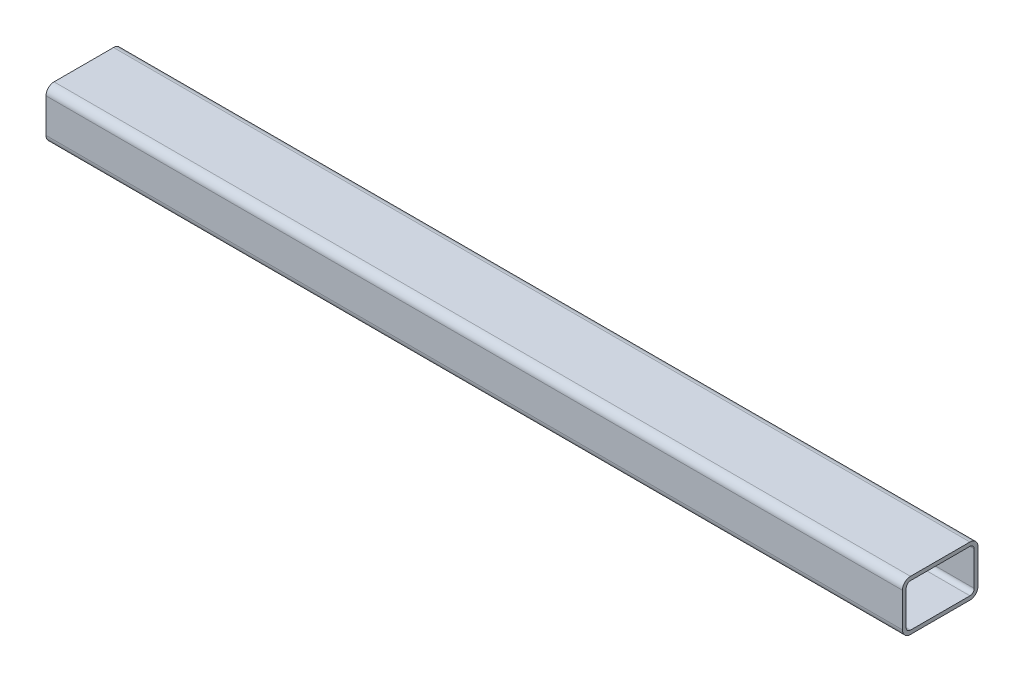
ISO-10303-21;
HEADER;
FILE_DESCRIPTION(('STEP AP214'),'2;1');
FILE_NAME('part.step','',(''),(''),'','','');
FILE_SCHEMA(('AUTOMOTIVE_DESIGN { 1 0 10303 214 1 1 1 1 }'));
ENDSEC;
DATA;
#1=APPLICATION_CONTEXT('core data for automotive mechanical design processes');
#2=APPLICATION_PROTOCOL_DEFINITION('international standard','automotive_design',2000,#1);
#3=PRODUCT_CONTEXT('',#1,'mechanical');
#4=PRODUCT('Part','Part','',(#3));
#5=PRODUCT_RELATED_PRODUCT_CATEGORY('part','',(#4));
#6=PRODUCT_DEFINITION_FORMATION('','',#4);
#7=PRODUCT_DEFINITION_CONTEXT('part definition',#1,'design');
#8=PRODUCT_DEFINITION('design','',#6,#7);
#9=PRODUCT_DEFINITION_SHAPE('','',#8);
#10=(LENGTH_UNIT() NAMED_UNIT(*) SI_UNIT(.MILLI.,.METRE.));
#11=(NAMED_UNIT(*) PLANE_ANGLE_UNIT() SI_UNIT($,.RADIAN.));
#12=(NAMED_UNIT(*) SI_UNIT($,.STERADIAN.) SOLID_ANGLE_UNIT());
#13=UNCERTAINTY_MEASURE_WITH_UNIT(LENGTH_MEASURE(1.E-05),#10,'distance_accuracy_value','');
#14=(GEOMETRIC_REPRESENTATION_CONTEXT(3) GLOBAL_UNCERTAINTY_ASSIGNED_CONTEXT((#13)) GLOBAL_UNIT_ASSIGNED_CONTEXT((#10,
#11,#12)) REPRESENTATION_CONTEXT('',''));
#15=CARTESIAN_POINT('',(0.,0.,0.));
#16=DIRECTION('',(0.,0.,1.));
#17=DIRECTION('',(1.,0.,0.));
#18=AXIS2_PLACEMENT_3D('',#15,#16,#17);
#19=CARTESIAN_POINT('',(340.,13.6,23.6));
#20=DIRECTION('',(-1.,0.,0.));
#21=DIRECTION('',(0.,0.,1.));
#22=AXIS2_PLACEMENT_3D('',#19,#20,#21);
#23=CYLINDRICAL_SURFACE('',#22,6.4);
#24=CARTESIAN_POINT('',(-340.,13.6,23.6));
#25=DIRECTION('',(1.,0.,0.));
#26=DIRECTION('',(0.,0.,-1.));
#27=AXIS2_PLACEMENT_3D('',#24,#25,#26);
#28=CIRCLE('',#27,6.4);
#29=CARTESIAN_POINT('',(-340.,20.,23.6));
#30=VERTEX_POINT('',#29);
#31=CARTESIAN_POINT('',(-340.,13.6,30.));
#32=VERTEX_POINT('',#31);
#33=EDGE_CURVE('E210',#30,#32,#28,.T.);
#34=ORIENTED_EDGE('',*,*,#33,.T.);
#35=DIRECTION('',(-1.,0.,0.));
#36=VECTOR('',#35,1.);
#37=CARTESIAN_POINT('',(340.,13.6,30.));
#38=LINE('',#37,#36);
#39=CARTESIAN_POINT('',(340.,13.6,30.));
#40=VERTEX_POINT('',#39);
#41=EDGE_CURVE('E11',#40,#32,#38,.T.);
#42=ORIENTED_EDGE('',*,*,#41,.F.);
#43=CARTESIAN_POINT('',(340.,13.6,23.6));
#44=DIRECTION('',(1.,0.,0.));
#45=DIRECTION('',(0.,0.,-1.));
#46=AXIS2_PLACEMENT_3D('',#43,#44,#45);
#47=CIRCLE('',#46,6.4);
#48=CARTESIAN_POINT('',(340.,20.,23.6));
#49=VERTEX_POINT('',#48);
#50=EDGE_CURVE('E288',#49,#40,#47,.T.);
#51=ORIENTED_EDGE('',*,*,#50,.F.);
#52=DIRECTION('',(-1.,0.,0.));
#53=VECTOR('',#52,1.);
#54=CARTESIAN_POINT('',(340.,20.,23.6));
#55=LINE('',#54,#53);
#56=EDGE_CURVE('E225',#49,#30,#55,.T.);
#57=ORIENTED_EDGE('',*,*,#56,.T.);
#58=EDGE_LOOP('',(#34,#42,#51,#57));
#59=FACE_BOUND('',#58,.T.);
#60=ADVANCED_FACE('F38',(#59),#23,.T.);
#61=CARTESIAN_POINT('',(340.,13.6,30.));
#62=DIRECTION('',(0.,0.,-1.));
#63=DIRECTION('',(-1.,0.,0.));
#64=AXIS2_PLACEMENT_3D('',#61,#62,#63);
#65=PLANE('',#64);
#66=DIRECTION('',(0.,-1.,0.));
#67=VECTOR('',#66,1.);
#68=CARTESIAN_POINT('',(-340.,13.6,30.));
#69=LINE('',#68,#67);
#70=CARTESIAN_POINT('',(-340.,-13.6,30.));
#71=VERTEX_POINT('',#70);
#72=EDGE_CURVE('E213',#32,#71,#69,.T.);
#73=ORIENTED_EDGE('',*,*,#72,.T.);
#74=DIRECTION('',(-1.,0.,0.));
#75=VECTOR('',#74,1.);
#76=CARTESIAN_POINT('',(340.,-13.6,30.));
#77=LINE('',#76,#75);
#78=CARTESIAN_POINT('',(340.,-13.6,30.));
#79=VERTEX_POINT('',#78);
#80=EDGE_CURVE('E48',#79,#71,#77,.T.);
#81=ORIENTED_EDGE('',*,*,#80,.F.);
#82=DIRECTION('',(0.,-1.,0.));
#83=VECTOR('',#82,1.);
#84=CARTESIAN_POINT('',(340.,13.6,30.));
#85=LINE('',#84,#83);
#86=EDGE_CURVE('E290',#40,#79,#85,.T.);
#87=ORIENTED_EDGE('',*,*,#86,.F.);
#88=ORIENTED_EDGE('',*,*,#41,.T.);
#89=EDGE_LOOP('',(#73,#81,#87,#88));
#90=FACE_BOUND('',#89,.T.);
#91=ADVANCED_FACE('F326',(#90),#65,.F.);
#92=CARTESIAN_POINT('',(340.,-13.6,23.6));
#93=DIRECTION('',(-1.,0.,0.));
#94=DIRECTION('',(0.,0.,1.));
#95=AXIS2_PLACEMENT_3D('',#92,#93,#94);
#96=CYLINDRICAL_SURFACE('',#95,6.4);
#97=CARTESIAN_POINT('',(-340.,-13.6,23.6));
#98=DIRECTION('',(1.,0.,0.));
#99=DIRECTION('',(0.,0.,-1.));
#100=AXIS2_PLACEMENT_3D('',#97,#98,#99);
#101=CIRCLE('',#100,6.4);
#102=CARTESIAN_POINT('',(-340.,-20.,23.6));
#103=VERTEX_POINT('',#102);
#104=EDGE_CURVE('E215',#71,#103,#101,.T.);
#105=ORIENTED_EDGE('',*,*,#104,.T.);
#106=DIRECTION('',(-1.,0.,0.));
#107=VECTOR('',#106,1.);
#108=CARTESIAN_POINT('',(340.,-20.,23.6));
#109=LINE('',#108,#107);
#110=CARTESIAN_POINT('',(340.,-20.,23.6));
#111=VERTEX_POINT('',#110);
#112=EDGE_CURVE('E232',#111,#103,#109,.T.);
#113=ORIENTED_EDGE('',*,*,#112,.F.);
#114=CARTESIAN_POINT('',(340.,-13.6,23.6));
#115=DIRECTION('',(1.,0.,0.));
#116=DIRECTION('',(0.,0.,-1.));
#117=AXIS2_PLACEMENT_3D('',#114,#115,#116);
#118=CIRCLE('',#117,6.4);
#119=EDGE_CURVE('E292',#79,#111,#118,.T.);
#120=ORIENTED_EDGE('',*,*,#119,.F.);
#121=ORIENTED_EDGE('',*,*,#80,.T.);
#122=EDGE_LOOP('',(#105,#113,#120,#121));
#123=FACE_BOUND('',#122,.T.);
#124=ADVANCED_FACE('F332',(#123),#96,.T.);
#125=CARTESIAN_POINT('',(340.,-20.,-23.6));
#126=DIRECTION('',(0.,1.,0.));
#127=DIRECTION('',(0.,0.,1.));
#128=AXIS2_PLACEMENT_3D('',#125,#126,#127);
#129=PLANE('',#128);
#130=DIRECTION('',(0.,0.,-1.));
#131=VECTOR('',#130,1.);
#132=CARTESIAN_POINT('',(-340.,-20.,-23.6));
#133=LINE('',#132,#131);
#134=CARTESIAN_POINT('',(-340.,-20.,-23.6));
#135=VERTEX_POINT('',#134);
#136=EDGE_CURVE('E217',#103,#135,#133,.T.);
#137=ORIENTED_EDGE('',*,*,#136,.T.);
#138=DIRECTION('',(-1.,0.,0.));
#139=VECTOR('',#138,1.);
#140=CARTESIAN_POINT('',(340.,-20.,-23.6));
#141=LINE('',#140,#139);
#142=CARTESIAN_POINT('',(340.,-20.,-23.6));
#143=VERTEX_POINT('',#142);
#144=EDGE_CURVE('E229',#143,#135,#141,.T.);
#145=ORIENTED_EDGE('',*,*,#144,.F.);
#146=DIRECTION('',(0.,0.,-1.));
#147=VECTOR('',#146,1.);
#148=CARTESIAN_POINT('',(340.,-20.,-23.6));
#149=LINE('',#148,#147);
#150=EDGE_CURVE('E294',#111,#143,#149,.T.);
#151=ORIENTED_EDGE('',*,*,#150,.F.);
#152=ORIENTED_EDGE('',*,*,#112,.T.);
#153=EDGE_LOOP('',(#137,#145,#151,#152));
#154=FACE_BOUND('',#153,.T.);
#155=ADVANCED_FACE('F300',(#154),#129,.F.);
#156=CARTESIAN_POINT('',(340.,-13.6,-23.6));
#157=DIRECTION('',(-1.,0.,0.));
#158=DIRECTION('',(0.,0.,1.));
#159=AXIS2_PLACEMENT_3D('',#156,#157,#158);
#160=CYLINDRICAL_SURFACE('',#159,6.4);
#161=CARTESIAN_POINT('',(-340.,-13.6,-23.6));
#162=DIRECTION('',(1.,0.,0.));
#163=DIRECTION('',(0.,0.,-1.));
#164=AXIS2_PLACEMENT_3D('',#161,#162,#163);
#165=CIRCLE('',#164,6.4);
#166=CARTESIAN_POINT('',(-340.,-13.6,-30.));
#167=VERTEX_POINT('',#166);
#168=EDGE_CURVE('E219',#135,#167,#165,.T.);
#169=ORIENTED_EDGE('',*,*,#168,.T.);
#170=DIRECTION('',(-1.,0.,0.));
#171=VECTOR('',#170,1.);
#172=CARTESIAN_POINT('',(340.,-13.6,-30.));
#173=LINE('',#172,#171);
#174=CARTESIAN_POINT('',(340.,-13.6,-30.));
#175=VERTEX_POINT('',#174);
#176=EDGE_CURVE('E177',#175,#167,#173,.T.);
#177=ORIENTED_EDGE('',*,*,#176,.F.);
#178=CARTESIAN_POINT('',(340.,-13.6,-23.6));
#179=DIRECTION('',(1.,0.,0.));
#180=DIRECTION('',(0.,0.,-1.));
#181=AXIS2_PLACEMENT_3D('',#178,#179,#180);
#182=CIRCLE('',#181,6.4);
#183=EDGE_CURVE('E168',#143,#175,#182,.T.);
#184=ORIENTED_EDGE('',*,*,#183,.F.);
#185=ORIENTED_EDGE('',*,*,#144,.T.);
#186=EDGE_LOOP('',(#169,#177,#184,#185));
#187=FACE_BOUND('',#186,.T.);
#188=ADVANCED_FACE('F304',(#187),#160,.T.);
#189=CARTESIAN_POINT('',(340.,-13.6,-30.));
#190=DIRECTION('',(0.,0.,1.));
#191=DIRECTION('',(1.,0.,0.));
#192=AXIS2_PLACEMENT_3D('',#189,#190,#191);
#193=PLANE('',#192);
#194=DIRECTION('',(0.,1.,0.));
#195=VECTOR('',#194,1.);
#196=CARTESIAN_POINT('',(-340.,-13.6,-30.));
#197=LINE('',#196,#195);
#198=CARTESIAN_POINT('',(-340.,13.6,-30.));
#199=VERTEX_POINT('',#198);
#200=EDGE_CURVE('E176',#167,#199,#197,.T.);
#201=ORIENTED_EDGE('',*,*,#200,.T.);
#202=DIRECTION('',(-1.,0.,0.));
#203=VECTOR('',#202,1.);
#204=CARTESIAN_POINT('',(340.,13.6,-30.));
#205=LINE('',#204,#203);
#206=CARTESIAN_POINT('',(340.,13.6,-30.));
#207=VERTEX_POINT('',#206);
#208=EDGE_CURVE('E173',#207,#199,#205,.T.);
#209=ORIENTED_EDGE('',*,*,#208,.F.);
#210=DIRECTION('',(0.,1.,0.));
#211=VECTOR('',#210,1.);
#212=CARTESIAN_POINT('',(340.,-13.6,-30.));
#213=LINE('',#212,#211);
#214=EDGE_CURVE('E162',#175,#207,#213,.T.);
#215=ORIENTED_EDGE('',*,*,#214,.F.);
#216=ORIENTED_EDGE('',*,*,#176,.T.);
#217=EDGE_LOOP('',(#201,#209,#215,#216));
#218=FACE_BOUND('',#217,.T.);
#219=ADVANCED_FACE('F174',(#218),#193,.F.);
#220=CARTESIAN_POINT('',(340.,13.6,-23.6));
#221=DIRECTION('',(-1.,0.,0.));
#222=DIRECTION('',(0.,0.,1.));
#223=AXIS2_PLACEMENT_3D('',#220,#221,#222);
#224=CYLINDRICAL_SURFACE('',#223,6.4);
#225=CARTESIAN_POINT('',(-340.,13.6,-23.6));
#226=DIRECTION('',(1.,0.,0.));
#227=DIRECTION('',(0.,0.,-1.));
#228=AXIS2_PLACEMENT_3D('',#225,#226,#227);
#229=CIRCLE('',#228,6.4);
#230=CARTESIAN_POINT('',(-340.,20.,-23.6));
#231=VERTEX_POINT('',#230);
#232=EDGE_CURVE('E110',#199,#231,#229,.T.);
#233=ORIENTED_EDGE('',*,*,#232,.T.);
#234=DIRECTION('',(-1.,0.,0.));
#235=VECTOR('',#234,1.);
#236=CARTESIAN_POINT('',(340.,20.,-23.6));
#237=LINE('',#236,#235);
#238=CARTESIAN_POINT('',(340.,20.,-23.6));
#239=VERTEX_POINT('',#238);
#240=EDGE_CURVE('E178',#239,#231,#237,.T.);
#241=ORIENTED_EDGE('',*,*,#240,.F.);
#242=CARTESIAN_POINT('',(340.,13.6,-23.6));
#243=DIRECTION('',(1.,0.,0.));
#244=DIRECTION('',(0.,0.,-1.));
#245=AXIS2_PLACEMENT_3D('',#242,#243,#244);
#246=CIRCLE('',#245,6.4);
#247=EDGE_CURVE('E166',#207,#239,#246,.T.);
#248=ORIENTED_EDGE('',*,*,#247,.F.);
#249=ORIENTED_EDGE('',*,*,#208,.T.);
#250=EDGE_LOOP('',(#233,#241,#248,#249));
#251=FACE_BOUND('',#250,.T.);
#252=ADVANCED_FACE('F180',(#251),#224,.T.);
#253=CARTESIAN_POINT('',(340.,-13.6,23.6));
#254=DIRECTION('',(-1.,0.,0.));
#255=DIRECTION('',(0.,0.,1.));
#256=AXIS2_PLACEMENT_3D('',#253,#254,#255);
#257=CYLINDRICAL_SURFACE('',#256,3.4);
#258=CARTESIAN_POINT('',(-340.,-13.6,23.6));
#259=DIRECTION('',(1.,0.,0.));
#260=DIRECTION('',(0.,0.,-1.));
#261=AXIS2_PLACEMENT_3D('',#258,#259,#260);
#262=CIRCLE('',#261,3.4);
#263=CARTESIAN_POINT('',(-340.,-13.6,27.));
#264=VERTEX_POINT('',#263);
#265=CARTESIAN_POINT('',(-340.,-17.,23.6));
#266=VERTEX_POINT('',#265);
#267=EDGE_CURVE('E186',#264,#266,#262,.T.);
#268=ORIENTED_EDGE('',*,*,#267,.F.);
#269=DIRECTION('',(-1.,0.,0.));
#270=VECTOR('',#269,1.);
#271=CARTESIAN_POINT('',(340.,-13.6,27.));
#272=LINE('',#271,#270);
#273=CARTESIAN_POINT('',(340.,-13.6,27.));
#274=VERTEX_POINT('',#273);
#275=EDGE_CURVE('E42',#274,#264,#272,.T.);
#276=ORIENTED_EDGE('',*,*,#275,.F.);
#277=CARTESIAN_POINT('',(340.,-13.6,23.6));
#278=DIRECTION('',(1.,0.,0.));
#279=DIRECTION('',(0.,0.,-1.));
#280=AXIS2_PLACEMENT_3D('',#277,#278,#279);
#281=CIRCLE('',#280,3.4);
#282=CARTESIAN_POINT('',(340.,-17.,23.6));
#283=VERTEX_POINT('',#282);
#284=EDGE_CURVE('E224',#274,#283,#281,.T.);
#285=ORIENTED_EDGE('',*,*,#284,.T.);
#286=DIRECTION('',(-1.,0.,0.));
#287=VECTOR('',#286,1.);
#288=CARTESIAN_POINT('',(340.,-17.,23.6));
#289=LINE('',#288,#287);
#290=EDGE_CURVE('E182',#283,#266,#289,.T.);
#291=ORIENTED_EDGE('',*,*,#290,.T.);
#292=EDGE_LOOP('',(#268,#276,#285,#291));
#293=FACE_BOUND('',#292,.T.);
#294=ADVANCED_FACE('F40',(#293),#257,.F.);
#295=CARTESIAN_POINT('',(340.,13.6,27.));
#296=DIRECTION('',(0.,0.,-1.));
#297=DIRECTION('',(-1.,0.,0.));
#298=AXIS2_PLACEMENT_3D('',#295,#296,#297);
#299=PLANE('',#298);
#300=DIRECTION('',(0.,-1.,0.));
#301=VECTOR('',#300,1.);
#302=CARTESIAN_POINT('',(-340.,13.6,27.));
#303=LINE('',#302,#301);
#304=CARTESIAN_POINT('',(-340.,13.6,27.));
#305=VERTEX_POINT('',#304);
#306=EDGE_CURVE('E189',#305,#264,#303,.T.);
#307=ORIENTED_EDGE('',*,*,#306,.F.);
#308=DIRECTION('',(-1.,0.,0.));
#309=VECTOR('',#308,1.);
#310=CARTESIAN_POINT('',(340.,13.6,27.));
#311=LINE('',#310,#309);
#312=CARTESIAN_POINT('',(340.,13.6,27.));
#313=VERTEX_POINT('',#312);
#314=EDGE_CURVE('E247',#313,#305,#311,.T.);
#315=ORIENTED_EDGE('',*,*,#314,.F.);
#316=DIRECTION('',(0.,-1.,0.));
#317=VECTOR('',#316,1.);
#318=CARTESIAN_POINT('',(340.,13.6,27.));
#319=LINE('',#318,#317);
#320=EDGE_CURVE('E256',#313,#274,#319,.T.);
#321=ORIENTED_EDGE('',*,*,#320,.T.);
#322=ORIENTED_EDGE('',*,*,#275,.T.);
#323=EDGE_LOOP('',(#307,#315,#321,#322));
#324=FACE_BOUND('',#323,.T.);
#325=ADVANCED_FACE('F254',(#324),#299,.T.);
#326=CARTESIAN_POINT('',(340.,13.6,23.6));
#327=DIRECTION('',(-1.,0.,0.));
#328=DIRECTION('',(0.,0.,1.));
#329=AXIS2_PLACEMENT_3D('',#326,#327,#328);
#330=CYLINDRICAL_SURFACE('',#329,3.4);
#331=CARTESIAN_POINT('',(-340.,13.6,23.6));
#332=DIRECTION('',(1.,0.,0.));
#333=DIRECTION('',(0.,0.,-1.));
#334=AXIS2_PLACEMENT_3D('',#331,#332,#333);
#335=CIRCLE('',#334,3.4);
#336=CARTESIAN_POINT('',(-340.,17.,23.6));
#337=VERTEX_POINT('',#336);
#338=EDGE_CURVE('E192',#337,#305,#335,.T.);
#339=ORIENTED_EDGE('',*,*,#338,.F.);
#340=DIRECTION('',(-1.,0.,0.));
#341=VECTOR('',#340,1.);
#342=CARTESIAN_POINT('',(340.,17.,23.6));
#343=LINE('',#342,#341);
#344=CARTESIAN_POINT('',(340.,17.,23.6));
#345=VERTEX_POINT('',#344);
#346=EDGE_CURVE('E246',#345,#337,#343,.T.);
#347=ORIENTED_EDGE('',*,*,#346,.F.);
#348=CARTESIAN_POINT('',(340.,13.6,23.6));
#349=DIRECTION('',(1.,0.,0.));
#350=DIRECTION('',(0.,0.,-1.));
#351=AXIS2_PLACEMENT_3D('',#348,#349,#350);
#352=CIRCLE('',#351,3.4);
#353=EDGE_CURVE('E264',#345,#313,#352,.T.);
#354=ORIENTED_EDGE('',*,*,#353,.T.);
#355=ORIENTED_EDGE('',*,*,#314,.T.);
#356=EDGE_LOOP('',(#339,#347,#354,#355));
#357=FACE_BOUND('',#356,.T.);
#358=ADVANCED_FACE('F262',(#357),#330,.F.);
#359=CARTESIAN_POINT('',(340.,17.,23.6));
#360=DIRECTION('',(0.,-1.,0.));
#361=DIRECTION('',(0.,0.,-1.));
#362=AXIS2_PLACEMENT_3D('',#359,#360,#361);
#363=PLANE('',#362);
#364=DIRECTION('',(0.,0.,1.));
#365=VECTOR('',#364,1.);
#366=CARTESIAN_POINT('',(-340.,17.,23.6));
#367=LINE('',#366,#365);
#368=CARTESIAN_POINT('',(-340.,17.,-23.6));
#369=VERTEX_POINT('',#368);
#370=EDGE_CURVE('E195',#369,#337,#367,.T.);
#371=ORIENTED_EDGE('',*,*,#370,.F.);
#372=DIRECTION('',(-1.,0.,0.));
#373=VECTOR('',#372,1.);
#374=CARTESIAN_POINT('',(340.,17.,-23.6));
#375=LINE('',#374,#373);
#376=CARTESIAN_POINT('',(340.,17.,-23.6));
#377=VERTEX_POINT('',#376);
#378=EDGE_CURVE('E244',#377,#369,#375,.T.);
#379=ORIENTED_EDGE('',*,*,#378,.F.);
#380=DIRECTION('',(0.,0.,1.));
#381=VECTOR('',#380,1.);
#382=CARTESIAN_POINT('',(340.,17.,23.6));
#383=LINE('',#382,#381);
#384=EDGE_CURVE('E270',#377,#345,#383,.T.);
#385=ORIENTED_EDGE('',*,*,#384,.T.);
#386=ORIENTED_EDGE('',*,*,#346,.T.);
#387=EDGE_LOOP('',(#371,#379,#385,#386));
#388=FACE_BOUND('',#387,.T.);
#389=ADVANCED_FACE('F273',(#388),#363,.T.);
#390=CARTESIAN_POINT('',(340.,13.6,-23.6));
#391=DIRECTION('',(-1.,0.,0.));
#392=DIRECTION('',(0.,0.,1.));
#393=AXIS2_PLACEMENT_3D('',#390,#391,#392);
#394=CYLINDRICAL_SURFACE('',#393,3.4);
#395=CARTESIAN_POINT('',(-340.,13.6,-23.6));
#396=DIRECTION('',(1.,0.,0.));
#397=DIRECTION('',(0.,0.,-1.));
#398=AXIS2_PLACEMENT_3D('',#395,#396,#397);
#399=CIRCLE('',#398,3.4);
#400=CARTESIAN_POINT('',(-340.,13.6,-27.));
#401=VERTEX_POINT('',#400);
#402=EDGE_CURVE('E198',#401,#369,#399,.T.);
#403=ORIENTED_EDGE('',*,*,#402,.F.);
#404=DIRECTION('',(-1.,0.,0.));
#405=VECTOR('',#404,1.);
#406=CARTESIAN_POINT('',(340.,13.6,-27.));
#407=LINE('',#406,#405);
#408=CARTESIAN_POINT('',(340.,13.6,-27.));
#409=VERTEX_POINT('',#408);
#410=EDGE_CURVE('E242',#409,#401,#407,.T.);
#411=ORIENTED_EDGE('',*,*,#410,.F.);
#412=CARTESIAN_POINT('',(340.,13.6,-23.6));
#413=DIRECTION('',(1.,0.,0.));
#414=DIRECTION('',(0.,0.,-1.));
#415=AXIS2_PLACEMENT_3D('',#412,#413,#414);
#416=CIRCLE('',#415,3.4);
#417=EDGE_CURVE('E274',#409,#377,#416,.T.);
#418=ORIENTED_EDGE('',*,*,#417,.T.);
#419=ORIENTED_EDGE('',*,*,#378,.T.);
#420=EDGE_LOOP('',(#403,#411,#418,#419));
#421=FACE_BOUND('',#420,.T.);
#422=ADVANCED_FACE('F343',(#421),#394,.F.);
#423=CARTESIAN_POINT('',(340.,-13.6,-27.));
#424=DIRECTION('',(0.,0.,1.));
#425=DIRECTION('',(1.,0.,0.));
#426=AXIS2_PLACEMENT_3D('',#423,#424,#425);
#427=PLANE('',#426);
#428=DIRECTION('',(0.,1.,0.));
#429=VECTOR('',#428,1.);
#430=CARTESIAN_POINT('',(-340.,-13.6,-27.));
#431=LINE('',#430,#429);
#432=CARTESIAN_POINT('',(-340.,-13.6,-27.));
#433=VERTEX_POINT('',#432);
#434=EDGE_CURVE('E201',#433,#401,#431,.T.);
#435=ORIENTED_EDGE('',*,*,#434,.F.);
#436=DIRECTION('',(-1.,0.,0.));
#437=VECTOR('',#436,1.);
#438=CARTESIAN_POINT('',(340.,-13.6,-27.));
#439=LINE('',#438,#437);
#440=CARTESIAN_POINT('',(340.,-13.6,-27.));
#441=VERTEX_POINT('',#440);
#442=EDGE_CURVE('E240',#441,#433,#439,.T.);
#443=ORIENTED_EDGE('',*,*,#442,.F.);
#444=DIRECTION('',(0.,1.,0.));
#445=VECTOR('',#444,1.);
#446=CARTESIAN_POINT('',(340.,-13.6,-27.));
#447=LINE('',#446,#445);
#448=EDGE_CURVE('E276',#441,#409,#447,.T.);
#449=ORIENTED_EDGE('',*,*,#448,.T.);
#450=ORIENTED_EDGE('',*,*,#410,.T.);
#451=EDGE_LOOP('',(#435,#443,#449,#450));
#452=FACE_BOUND('',#451,.T.);
#453=ADVANCED_FACE('F339',(#452),#427,.T.);
#454=CARTESIAN_POINT('',(340.,-13.6,-23.6));
#455=DIRECTION('',(-1.,0.,0.));
#456=DIRECTION('',(0.,0.,1.));
#457=AXIS2_PLACEMENT_3D('',#454,#455,#456);
#458=CYLINDRICAL_SURFACE('',#457,3.4);
#459=CARTESIAN_POINT('',(-340.,-13.6,-23.6));
#460=DIRECTION('',(1.,0.,0.));
#461=DIRECTION('',(0.,0.,-1.));
#462=AXIS2_PLACEMENT_3D('',#459,#460,#461);
#463=CIRCLE('',#462,3.4);
#464=CARTESIAN_POINT('',(-340.,-17.,-23.6));
#465=VERTEX_POINT('',#464);
#466=EDGE_CURVE('E204',#465,#433,#463,.T.);
#467=ORIENTED_EDGE('',*,*,#466,.F.);
#468=DIRECTION('',(-1.,0.,0.));
#469=VECTOR('',#468,1.);
#470=CARTESIAN_POINT('',(340.,-17.,-23.6));
#471=LINE('',#470,#469);
#472=CARTESIAN_POINT('',(340.,-17.,-23.6));
#473=VERTEX_POINT('',#472);
#474=EDGE_CURVE('E238',#473,#465,#471,.T.);
#475=ORIENTED_EDGE('',*,*,#474,.F.);
#476=CARTESIAN_POINT('',(340.,-13.6,-23.6));
#477=DIRECTION('',(1.,0.,0.));
#478=DIRECTION('',(0.,0.,-1.));
#479=AXIS2_PLACEMENT_3D('',#476,#477,#478);
#480=CIRCLE('',#479,3.4);
#481=EDGE_CURVE('E282',#473,#441,#480,.T.);
#482=ORIENTED_EDGE('',*,*,#481,.T.);
#483=ORIENTED_EDGE('',*,*,#442,.T.);
#484=EDGE_LOOP('',(#467,#475,#482,#483));
#485=FACE_BOUND('',#484,.T.);
#486=ADVANCED_FACE('F320',(#485),#458,.F.);
#487=CARTESIAN_POINT('',(340.,-17.,-23.6));
#488=DIRECTION('',(0.,1.,0.));
#489=DIRECTION('',(0.,0.,1.));
#490=AXIS2_PLACEMENT_3D('',#487,#488,#489);
#491=PLANE('',#490);
#492=DIRECTION('',(0.,0.,-1.));
#493=VECTOR('',#492,1.);
#494=CARTESIAN_POINT('',(-340.,-17.,-23.6));
#495=LINE('',#494,#493);
#496=EDGE_CURVE('E207',#266,#465,#495,.T.);
#497=ORIENTED_EDGE('',*,*,#496,.F.);
#498=ORIENTED_EDGE('',*,*,#290,.F.);
#499=DIRECTION('',(0.,0.,-1.));
#500=VECTOR('',#499,1.);
#501=CARTESIAN_POINT('',(340.,-17.,-23.6));
#502=LINE('',#501,#500);
#503=EDGE_CURVE('E285',#283,#473,#502,.T.);
#504=ORIENTED_EDGE('',*,*,#503,.T.);
#505=ORIENTED_EDGE('',*,*,#474,.T.);
#506=EDGE_LOOP('',(#497,#498,#504,#505));
#507=FACE_BOUND('',#506,.T.);
#508=ADVANCED_FACE('F312',(#507),#491,.T.);
#509=CARTESIAN_POINT('',(340.,20.,23.6));
#510=DIRECTION('',(0.,-1.,0.));
#511=DIRECTION('',(0.,0.,-1.));
#512=AXIS2_PLACEMENT_3D('',#509,#510,#511);
#513=PLANE('',#512);
#514=DIRECTION('',(0.,0.,1.));
#515=VECTOR('',#514,1.);
#516=CARTESIAN_POINT('',(-340.,20.,23.6));
#517=LINE('',#516,#515);
#518=EDGE_CURVE('E116',#231,#30,#517,.T.);
#519=ORIENTED_EDGE('',*,*,#518,.T.);
#520=ORIENTED_EDGE('',*,*,#56,.F.);
#521=DIRECTION('',(0.,0.,1.));
#522=VECTOR('',#521,1.);
#523=CARTESIAN_POINT('',(340.,20.,23.6));
#524=LINE('',#523,#522);
#525=EDGE_CURVE('E57',#239,#49,#524,.T.);
#526=ORIENTED_EDGE('',*,*,#525,.F.);
#527=ORIENTED_EDGE('',*,*,#240,.T.);
#528=EDGE_LOOP('',(#519,#520,#526,#527));
#529=FACE_BOUND('',#528,.T.);
#530=ADVANCED_FACE('F310',(#529),#513,.F.);
#531=CARTESIAN_POINT('',(340.,13.6,23.6));
#532=DIRECTION('',(1.,0.,0.));
#533=DIRECTION('',(0.,0.,-1.));
#534=AXIS2_PLACEMENT_3D('',#531,#532,#533);
#535=PLANE('',#534);
#536=ORIENTED_EDGE('',*,*,#284,.F.);
#537=ORIENTED_EDGE('',*,*,#320,.F.);
#538=ORIENTED_EDGE('',*,*,#353,.F.);
#539=ORIENTED_EDGE('',*,*,#384,.F.);
#540=ORIENTED_EDGE('',*,*,#417,.F.);
#541=ORIENTED_EDGE('',*,*,#448,.F.);
#542=ORIENTED_EDGE('',*,*,#481,.F.);
#543=ORIENTED_EDGE('',*,*,#503,.F.);
#544=EDGE_LOOP('',(#536,#537,#538,#539,#540,#541,#542,#543));
#545=FACE_BOUND('',#544,.T.);
#546=ORIENTED_EDGE('',*,*,#50,.T.);
#547=ORIENTED_EDGE('',*,*,#86,.T.);
#548=ORIENTED_EDGE('',*,*,#119,.T.);
#549=ORIENTED_EDGE('',*,*,#150,.T.);
#550=ORIENTED_EDGE('',*,*,#183,.T.);
#551=ORIENTED_EDGE('',*,*,#214,.T.);
#552=ORIENTED_EDGE('',*,*,#247,.T.);
#553=ORIENTED_EDGE('',*,*,#525,.T.);
#554=EDGE_LOOP('',(#546,#547,#548,#549,#550,#551,#552,#553));
#555=FACE_BOUND('',#554,.T.);
#556=ADVANCED_FACE('F164',(#545,#555),#535,.T.);
#557=CARTESIAN_POINT('',(-340.,13.6,23.6));
#558=DIRECTION('',(1.,0.,0.));
#559=DIRECTION('',(0.,0.,-1.));
#560=AXIS2_PLACEMENT_3D('',#557,#558,#559);
#561=PLANE('',#560);
#562=ORIENTED_EDGE('',*,*,#267,.T.);
#563=ORIENTED_EDGE('',*,*,#496,.T.);
#564=ORIENTED_EDGE('',*,*,#466,.T.);
#565=ORIENTED_EDGE('',*,*,#434,.T.);
#566=ORIENTED_EDGE('',*,*,#402,.T.);
#567=ORIENTED_EDGE('',*,*,#370,.T.);
#568=ORIENTED_EDGE('',*,*,#338,.T.);
#569=ORIENTED_EDGE('',*,*,#306,.T.);
#570=EDGE_LOOP('',(#562,#563,#564,#565,#566,#567,#568,#569));
#571=FACE_BOUND('',#570,.T.);
#572=ORIENTED_EDGE('',*,*,#33,.F.);
#573=ORIENTED_EDGE('',*,*,#518,.F.);
#574=ORIENTED_EDGE('',*,*,#232,.F.);
#575=ORIENTED_EDGE('',*,*,#200,.F.);
#576=ORIENTED_EDGE('',*,*,#168,.F.);
#577=ORIENTED_EDGE('',*,*,#136,.F.);
#578=ORIENTED_EDGE('',*,*,#104,.F.);
#579=ORIENTED_EDGE('',*,*,#72,.F.);
#580=EDGE_LOOP('',(#572,#573,#574,#575,#576,#577,#578,#579));
#581=FACE_BOUND('',#580,.T.);
#582=ADVANCED_FACE('F259',(#571,#581),#561,.F.);
#583=CLOSED_SHELL('',(#60,#91,#124,#155,#188,#219,#252,#294,#325,#358,#389,#422,#453,#486,#508,
#530,#556,#582));
#584=MANIFOLD_SOLID_BREP('B2',#583);
#585=ADVANCED_BREP_SHAPE_REPRESENTATION('',(#18,#584),#14);
#586=SHAPE_DEFINITION_REPRESENTATION(#9,#585);
ENDSEC;
END-ISO-10303-21;
